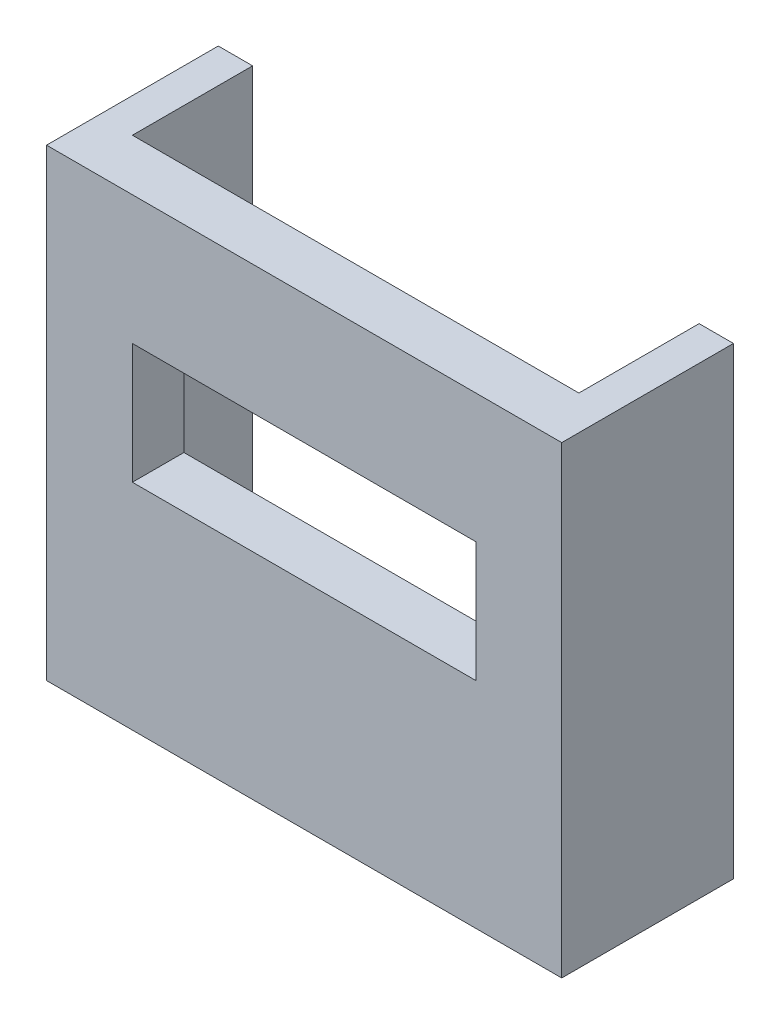
ISO-10303-21;
HEADER;
FILE_DESCRIPTION(('STEP AP214'),'2;1');
FILE_NAME('part.step','',(''),(''),'','','');
FILE_SCHEMA(('AUTOMOTIVE_DESIGN { 1 0 10303 214 1 1 1 1 }'));
ENDSEC;
DATA;
#1=APPLICATION_CONTEXT('core data for automotive mechanical design processes');
#2=APPLICATION_PROTOCOL_DEFINITION('international standard','automotive_design',2000,#1);
#3=PRODUCT_CONTEXT('',#1,'mechanical');
#4=PRODUCT('Part','Part','',(#3));
#5=PRODUCT_RELATED_PRODUCT_CATEGORY('part','',(#4));
#6=PRODUCT_DEFINITION_FORMATION('','',#4);
#7=PRODUCT_DEFINITION_CONTEXT('part definition',#1,'design');
#8=PRODUCT_DEFINITION('design','',#6,#7);
#9=PRODUCT_DEFINITION_SHAPE('','',#8);
#10=(LENGTH_UNIT() NAMED_UNIT(*) SI_UNIT(.MILLI.,.METRE.));
#11=(NAMED_UNIT(*) PLANE_ANGLE_UNIT() SI_UNIT($,.RADIAN.));
#12=(NAMED_UNIT(*) SI_UNIT($,.STERADIAN.) SOLID_ANGLE_UNIT());
#13=UNCERTAINTY_MEASURE_WITH_UNIT(LENGTH_MEASURE(1.E-05),#10,'distance_accuracy_value','');
#14=(GEOMETRIC_REPRESENTATION_CONTEXT(3) GLOBAL_UNCERTAINTY_ASSIGNED_CONTEXT((#13)) GLOBAL_UNIT_ASSIGNED_CONTEXT((#10,
#11,#12)) REPRESENTATION_CONTEXT('',''));
#15=CARTESIAN_POINT('',(0.,0.,0.));
#16=DIRECTION('',(0.,0.,1.));
#17=DIRECTION('',(1.,0.,0.));
#18=AXIS2_PLACEMENT_3D('',#15,#16,#17);
#19=CARTESIAN_POINT('',(0.,30.,0.));
#20=DIRECTION('',(-1.,0.,0.));
#21=DIRECTION('',(0.,0.,1.));
#22=AXIS2_PLACEMENT_3D('',#19,#20,#21);
#23=PLANE('',#22);
#24=DIRECTION('',(0.,0.,1.));
#25=VECTOR('',#24,1.);
#26=CARTESIAN_POINT('',(0.,27.,10.));
#27=LINE('',#26,#25);
#28=CARTESIAN_POINT('',(0.,27.,0.));
#29=VERTEX_POINT('',#28);
#30=CARTESIAN_POINT('',(0.,27.,10.));
#31=VERTEX_POINT('',#30);
#32=EDGE_CURVE('E138',#29,#31,#27,.T.);
#33=ORIENTED_EDGE('',*,*,#32,.T.);
#34=DIRECTION('',(0.,-1.,0.));
#35=VECTOR('',#34,1.);
#36=CARTESIAN_POINT('',(0.,30.,10.));
#37=LINE('',#36,#35);
#38=CARTESIAN_POINT('',(0.,0.,10.));
#39=VERTEX_POINT('',#38);
#40=EDGE_CURVE('E168',#31,#39,#37,.T.);
#41=ORIENTED_EDGE('',*,*,#40,.T.);
#42=DIRECTION('',(0.,0.,-1.));
#43=VECTOR('',#42,1.);
#44=CARTESIAN_POINT('',(0.,0.,0.));
#45=LINE('',#44,#43);
#46=CARTESIAN_POINT('',(0.,0.,0.));
#47=VERTEX_POINT('',#46);
#48=EDGE_CURVE('E159',#39,#47,#45,.T.);
#49=ORIENTED_EDGE('',*,*,#48,.T.);
#50=DIRECTION('',(0.,-1.,0.));
#51=VECTOR('',#50,1.);
#52=CARTESIAN_POINT('',(0.,30.,0.));
#53=LINE('',#52,#51);
#54=EDGE_CURVE('E46',#29,#47,#53,.T.);
#55=ORIENTED_EDGE('',*,*,#54,.F.);
#56=EDGE_LOOP('',(#33,#41,#49,#55));
#57=FACE_BOUND('',#56,.T.);
#58=ADVANCED_FACE('F38',(#57),#23,.F.);
#59=CARTESIAN_POINT('',(0.,30.,0.));
#60=DIRECTION('',(0.,0.,1.));
#61=DIRECTION('',(1.,0.,0.));
#62=AXIS2_PLACEMENT_3D('',#59,#60,#61);
#63=PLANE('',#62);
#64=DIRECTION('',(1.,0.,0.));
#65=VECTOR('',#64,1.);
#66=CARTESIAN_POINT('',(0.,27.,0.));
#67=LINE('',#66,#65);
#68=CARTESIAN_POINT('',(-2.,27.,0.));
#69=VERTEX_POINT('',#68);
#70=EDGE_CURVE('E141',#69,#29,#67,.T.);
#71=ORIENTED_EDGE('',*,*,#70,.T.);
#72=ORIENTED_EDGE('',*,*,#54,.T.);
#73=DIRECTION('',(-1.,0.,0.));
#74=VECTOR('',#73,1.);
#75=CARTESIAN_POINT('',(0.,0.,0.));
#76=LINE('',#75,#74);
#77=CARTESIAN_POINT('',(-12.5,0.,0.));
#78=VERTEX_POINT('',#77);
#79=EDGE_CURVE('E179',#47,#78,#76,.T.);
#80=ORIENTED_EDGE('',*,*,#79,.T.);
#81=DIRECTION('',(0.,1.,0.));
#82=VECTOR('',#81,1.);
#83=CARTESIAN_POINT('',(-12.5,-0.00100000000000013,0.));
#84=LINE('',#83,#82);
#85=CARTESIAN_POINT('',(-12.5,3.,0.));
#86=VERTEX_POINT('',#85);
#87=EDGE_CURVE('E269',#86,#78,#84,.F.);
#88=ORIENTED_EDGE('',*,*,#87,.F.);
#89=DIRECTION('',(-1.,0.,0.));
#90=VECTOR('',#89,1.);
#91=CARTESIAN_POINT('',(-2.,3.,0.));
#92=LINE('',#91,#90);
#93=CARTESIAN_POINT('',(-2.,3.,0.));
#94=VERTEX_POINT('',#93);
#95=EDGE_CURVE('E241',#94,#86,#92,.T.);
#96=ORIENTED_EDGE('',*,*,#95,.F.);
#97=DIRECTION('',(0.,-1.,0.));
#98=VECTOR('',#97,1.);
#99=CARTESIAN_POINT('',(-2.,27.,0.));
#100=LINE('',#99,#98);
#101=EDGE_CURVE('E61',#69,#94,#100,.T.);
#102=ORIENTED_EDGE('',*,*,#101,.F.);
#103=EDGE_LOOP('',(#71,#72,#80,#88,#96,#102));
#104=FACE_BOUND('',#103,.T.);
#105=ADVANCED_FACE('F150',(#104),#63,.F.);
#106=CARTESIAN_POINT('',(-30.,27.,0.));
#107=VERTEX_POINT('',#106);
#108=CARTESIAN_POINT('',(-28.,27.,0.));
#109=VERTEX_POINT('',#108);
#110=EDGE_CURVE('E155',#107,#109,#67,.T.);
#111=ORIENTED_EDGE('',*,*,#110,.T.);
#112=DIRECTION('',(0.,1.,0.));
#113=VECTOR('',#112,1.);
#114=CARTESIAN_POINT('',(-28.,27.,0.));
#115=LINE('',#114,#113);
#116=CARTESIAN_POINT('',(-28.,3.,0.));
#117=VERTEX_POINT('',#116);
#118=EDGE_CURVE('E236',#117,#109,#115,.T.);
#119=ORIENTED_EDGE('',*,*,#118,.F.);
#120=CARTESIAN_POINT('',(-17.5,3.,0.));
#121=VERTEX_POINT('',#120);
#122=EDGE_CURVE('E245',#121,#117,#92,.T.);
#123=ORIENTED_EDGE('',*,*,#122,.F.);
#124=DIRECTION('',(0.,1.,0.));
#125=VECTOR('',#124,1.);
#126=CARTESIAN_POINT('',(-17.5,-0.00100000000000013,0.));
#127=LINE('',#126,#125);
#128=CARTESIAN_POINT('',(-17.5,0.,0.));
#129=VERTEX_POINT('',#128);
#130=EDGE_CURVE('E53',#129,#121,#127,.T.);
#131=ORIENTED_EDGE('',*,*,#130,.F.);
#132=CARTESIAN_POINT('',(-30.,0.,0.));
#133=VERTEX_POINT('',#132);
#134=EDGE_CURVE('E182',#129,#133,#76,.T.);
#135=ORIENTED_EDGE('',*,*,#134,.T.);
#136=DIRECTION('',(0.,-1.,0.));
#137=VECTOR('',#136,1.);
#138=CARTESIAN_POINT('',(-30.,30.,0.));
#139=LINE('',#138,#137);
#140=EDGE_CURVE('E161',#107,#133,#139,.T.);
#141=ORIENTED_EDGE('',*,*,#140,.F.);
#142=EDGE_LOOP('',(#111,#119,#123,#131,#135,#141));
#143=FACE_BOUND('',#142,.T.);
#144=ADVANCED_FACE('F284',(#143),#63,.F.);
#145=CARTESIAN_POINT('',(-30.,30.,0.));
#146=DIRECTION('',(1.,0.,0.));
#147=DIRECTION('',(0.,0.,-1.));
#148=AXIS2_PLACEMENT_3D('',#145,#146,#147);
#149=PLANE('',#148);
#150=DIRECTION('',(0.,0.,-1.));
#151=VECTOR('',#150,1.);
#152=CARTESIAN_POINT('',(-30.,27.,0.));
#153=LINE('',#152,#151);
#154=CARTESIAN_POINT('',(-30.,27.,10.));
#155=VERTEX_POINT('',#154);
#156=EDGE_CURVE('E276',#155,#107,#153,.T.);
#157=ORIENTED_EDGE('',*,*,#156,.T.);
#158=ORIENTED_EDGE('',*,*,#140,.T.);
#159=DIRECTION('',(0.,0.,1.));
#160=VECTOR('',#159,1.);
#161=CARTESIAN_POINT('',(-30.,0.,0.));
#162=LINE('',#161,#160);
#163=CARTESIAN_POINT('',(-30.,0.,10.));
#164=VERTEX_POINT('',#163);
#165=EDGE_CURVE('E175',#133,#164,#162,.T.);
#166=ORIENTED_EDGE('',*,*,#165,.T.);
#167=DIRECTION('',(0.,-1.,0.));
#168=VECTOR('',#167,1.);
#169=CARTESIAN_POINT('',(-30.,30.,10.));
#170=LINE('',#169,#168);
#171=EDGE_CURVE('E163',#155,#164,#170,.T.);
#172=ORIENTED_EDGE('',*,*,#171,.F.);
#173=EDGE_LOOP('',(#157,#158,#166,#172));
#174=FACE_BOUND('',#173,.T.);
#175=ADVANCED_FACE('F303',(#174),#149,.F.);
#176=CARTESIAN_POINT('',(0.,30.,10.));
#177=DIRECTION('',(0.,0.,-1.));
#178=DIRECTION('',(-1.,0.,0.));
#179=AXIS2_PLACEMENT_3D('',#176,#177,#178);
#180=PLANE('',#179);
#181=DIRECTION('',(1.,0.,0.));
#182=VECTOR('',#181,1.);
#183=CARTESIAN_POINT('',(-25.,12.5,10.));
#184=LINE('',#183,#182);
#185=CARTESIAN_POINT('',(-25.,12.5,10.));
#186=VERTEX_POINT('',#185);
#187=CARTESIAN_POINT('',(-5.,12.5,10.));
#188=VERTEX_POINT('',#187);
#189=EDGE_CURVE('E205',#186,#188,#184,.T.);
#190=ORIENTED_EDGE('',*,*,#189,.F.);
#191=DIRECTION('',(0.,-1.,0.));
#192=VECTOR('',#191,1.);
#193=CARTESIAN_POINT('',(-25.,12.5,10.));
#194=LINE('',#193,#192);
#195=CARTESIAN_POINT('',(-25.,19.5,10.));
#196=VERTEX_POINT('',#195);
#197=EDGE_CURVE('E209',#196,#186,#194,.T.);
#198=ORIENTED_EDGE('',*,*,#197,.F.);
#199=DIRECTION('',(-1.,0.,0.));
#200=VECTOR('',#199,1.);
#201=CARTESIAN_POINT('',(-25.,19.5,10.));
#202=LINE('',#201,#200);
#203=CARTESIAN_POINT('',(-5.,19.5,10.));
#204=VERTEX_POINT('',#203);
#205=EDGE_CURVE('E190',#204,#196,#202,.T.);
#206=ORIENTED_EDGE('',*,*,#205,.F.);
#207=DIRECTION('',(0.,1.,0.));
#208=VECTOR('',#207,1.);
#209=CARTESIAN_POINT('',(-5.,12.5,10.));
#210=LINE('',#209,#208);
#211=EDGE_CURVE('E201',#188,#204,#210,.T.);
#212=ORIENTED_EDGE('',*,*,#211,.F.);
#213=EDGE_LOOP('',(#190,#198,#206,#212));
#214=FACE_BOUND('',#213,.T.);
#215=DIRECTION('',(-1.,0.,0.));
#216=VECTOR('',#215,1.);
#217=CARTESIAN_POINT('',(-30.,27.,10.));
#218=LINE('',#217,#216);
#219=EDGE_CURVE('E143',#31,#155,#218,.T.);
#220=ORIENTED_EDGE('',*,*,#219,.T.);
#221=ORIENTED_EDGE('',*,*,#171,.T.);
#222=DIRECTION('',(1.,0.,0.));
#223=VECTOR('',#222,1.);
#224=CARTESIAN_POINT('',(0.,0.,10.));
#225=LINE('',#224,#223);
#226=EDGE_CURVE('E171',#164,#39,#225,.T.);
#227=ORIENTED_EDGE('',*,*,#226,.T.);
#228=ORIENTED_EDGE('',*,*,#40,.F.);
#229=EDGE_LOOP('',(#220,#221,#227,#228));
#230=FACE_BOUND('',#229,.T.);
#231=ADVANCED_FACE('F305',(#214,#230),#180,.F.);
#232=CARTESIAN_POINT('',(-25.,12.5,-0.000999999999999265));
#233=DIRECTION('',(-1.,0.,0.));
#234=DIRECTION('',(0.,0.,1.));
#235=AXIS2_PLACEMENT_3D('',#232,#233,#234);
#236=PLANE('',#235);
#237=DIRECTION('',(0.,-1.,0.));
#238=VECTOR('',#237,1.);
#239=CARTESIAN_POINT('',(-25.,12.5,7.));
#240=LINE('',#239,#238);
#241=CARTESIAN_POINT('',(-25.,19.5,7.));
#242=VERTEX_POINT('',#241);
#243=CARTESIAN_POINT('',(-25.,12.5,7.));
#244=VERTEX_POINT('',#243);
#245=EDGE_CURVE('E213',#242,#244,#240,.T.);
#246=ORIENTED_EDGE('',*,*,#245,.F.);
#247=DIRECTION('',(0.,0.,1.));
#248=VECTOR('',#247,1.);
#249=CARTESIAN_POINT('',(-25.,19.5,-0.000999999999999265));
#250=LINE('',#249,#248);
#251=EDGE_CURVE('E185',#242,#196,#250,.T.);
#252=ORIENTED_EDGE('',*,*,#251,.T.);
#253=ORIENTED_EDGE('',*,*,#197,.T.);
#254=DIRECTION('',(0.,0.,1.));
#255=VECTOR('',#254,1.);
#256=CARTESIAN_POINT('',(-25.,12.5,-0.000999999999999265));
#257=LINE('',#256,#255);
#258=EDGE_CURVE('E186',#244,#186,#257,.T.);
#259=ORIENTED_EDGE('',*,*,#258,.F.);
#260=EDGE_LOOP('',(#246,#252,#253,#259));
#261=FACE_BOUND('',#260,.T.);
#262=ADVANCED_FACE('F324',(#261),#236,.F.);
#263=CARTESIAN_POINT('',(-25.,19.5,-0.000999999999999265));
#264=DIRECTION('',(0.,1.,0.));
#265=DIRECTION('',(0.,0.,1.));
#266=AXIS2_PLACEMENT_3D('',#263,#264,#265);
#267=PLANE('',#266);
#268=DIRECTION('',(-1.,0.,0.));
#269=VECTOR('',#268,1.);
#270=CARTESIAN_POINT('',(-25.,19.5,7.));
#271=LINE('',#270,#269);
#272=CARTESIAN_POINT('',(-5.,19.5,7.));
#273=VERTEX_POINT('',#272);
#274=EDGE_CURVE('E216',#273,#242,#271,.T.);
#275=ORIENTED_EDGE('',*,*,#274,.F.);
#276=DIRECTION('',(0.,0.,1.));
#277=VECTOR('',#276,1.);
#278=CARTESIAN_POINT('',(-5.,19.5,-0.000999999999999265));
#279=LINE('',#278,#277);
#280=EDGE_CURVE('E193',#273,#204,#279,.T.);
#281=ORIENTED_EDGE('',*,*,#280,.T.);
#282=ORIENTED_EDGE('',*,*,#205,.T.);
#283=ORIENTED_EDGE('',*,*,#251,.F.);
#284=EDGE_LOOP('',(#275,#281,#282,#283));
#285=FACE_BOUND('',#284,.T.);
#286=ADVANCED_FACE('F334',(#285),#267,.F.);
#287=CARTESIAN_POINT('',(-5.,12.5,-0.000999999999999265));
#288=DIRECTION('',(1.,0.,0.));
#289=DIRECTION('',(0.,0.,-1.));
#290=AXIS2_PLACEMENT_3D('',#287,#288,#289);
#291=PLANE('',#290);
#292=DIRECTION('',(0.,1.,0.));
#293=VECTOR('',#292,1.);
#294=CARTESIAN_POINT('',(-5.,12.5,7.));
#295=LINE('',#294,#293);
#296=CARTESIAN_POINT('',(-5.,12.5,7.));
#297=VERTEX_POINT('',#296);
#298=EDGE_CURVE('E219',#297,#273,#295,.T.);
#299=ORIENTED_EDGE('',*,*,#298,.F.);
#300=DIRECTION('',(0.,0.,1.));
#301=VECTOR('',#300,1.);
#302=CARTESIAN_POINT('',(-5.,12.5,-0.000999999999999265));
#303=LINE('',#302,#301);
#304=EDGE_CURVE('E189',#297,#188,#303,.T.);
#305=ORIENTED_EDGE('',*,*,#304,.T.);
#306=ORIENTED_EDGE('',*,*,#211,.T.);
#307=ORIENTED_EDGE('',*,*,#280,.F.);
#308=EDGE_LOOP('',(#299,#305,#306,#307));
#309=FACE_BOUND('',#308,.T.);
#310=ADVANCED_FACE('F332',(#309),#291,.F.);
#311=CARTESIAN_POINT('',(-25.,12.5,-0.000999999999999265));
#312=DIRECTION('',(0.,-1.,0.));
#313=DIRECTION('',(0.,0.,-1.));
#314=AXIS2_PLACEMENT_3D('',#311,#312,#313);
#315=PLANE('',#314);
#316=DIRECTION('',(1.,0.,0.));
#317=VECTOR('',#316,1.);
#318=CARTESIAN_POINT('',(-25.,12.5,7.));
#319=LINE('',#318,#317);
#320=EDGE_CURVE('E11',#244,#297,#319,.T.);
#321=ORIENTED_EDGE('',*,*,#320,.F.);
#322=ORIENTED_EDGE('',*,*,#258,.T.);
#323=ORIENTED_EDGE('',*,*,#189,.T.);
#324=ORIENTED_EDGE('',*,*,#304,.F.);
#325=EDGE_LOOP('',(#321,#322,#323,#324));
#326=FACE_BOUND('',#325,.T.);
#327=ADVANCED_FACE('F323',(#326),#315,.F.);
#328=CARTESIAN_POINT('',(0.,0.,0.));
#329=DIRECTION('',(0.,-1.,0.));
#330=DIRECTION('',(0.,0.,-1.));
#331=AXIS2_PLACEMENT_3D('',#328,#329,#330);
#332=PLANE('',#331);
#333=CARTESIAN_POINT('',(-15.,0.,0.));
#334=DIRECTION('',(0.,-1.,0.));
#335=DIRECTION('',(0.,0.,-1.));
#336=AXIS2_PLACEMENT_3D('',#333,#334,#335);
#337=CIRCLE('',#336,2.5);
#338=EDGE_CURVE('E248',#129,#78,#337,.F.);
#339=ORIENTED_EDGE('',*,*,#338,.T.);
#340=ORIENTED_EDGE('',*,*,#79,.F.);
#341=ORIENTED_EDGE('',*,*,#48,.F.);
#342=ORIENTED_EDGE('',*,*,#226,.F.);
#343=ORIENTED_EDGE('',*,*,#165,.F.);
#344=ORIENTED_EDGE('',*,*,#134,.F.);
#345=EDGE_LOOP('',(#339,#340,#341,#342,#343,#344));
#346=FACE_BOUND('',#345,.T.);
#347=ADVANCED_FACE('F300',(#346),#332,.T.);
#348=CARTESIAN_POINT('',(0.,0.,7.));
#349=DIRECTION('',(0.,0.,-1.));
#350=DIRECTION('',(-1.,0.,0.));
#351=AXIS2_PLACEMENT_3D('',#348,#349,#350);
#352=PLANE('',#351);
#353=DIRECTION('',(0.,-1.,0.));
#354=VECTOR('',#353,1.);
#355=CARTESIAN_POINT('',(-2.,27.,7.));
#356=LINE('',#355,#354);
#357=CARTESIAN_POINT('',(-2.,27.,7.));
#358=VERTEX_POINT('',#357);
#359=CARTESIAN_POINT('',(-2.,3.,7.));
#360=VERTEX_POINT('',#359);
#361=EDGE_CURVE('E240',#358,#360,#356,.T.);
#362=ORIENTED_EDGE('',*,*,#361,.T.);
#363=DIRECTION('',(-1.,0.,0.));
#364=VECTOR('',#363,1.);
#365=CARTESIAN_POINT('',(-2.,3.,7.));
#366=LINE('',#365,#364);
#367=CARTESIAN_POINT('',(-28.,3.,7.));
#368=VERTEX_POINT('',#367);
#369=EDGE_CURVE('E256',#360,#368,#366,.T.);
#370=ORIENTED_EDGE('',*,*,#369,.T.);
#371=DIRECTION('',(0.,1.,0.));
#372=VECTOR('',#371,1.);
#373=CARTESIAN_POINT('',(-28.,27.,7.));
#374=LINE('',#373,#372);
#375=CARTESIAN_POINT('',(-28.,27.,7.));
#376=VERTEX_POINT('',#375);
#377=EDGE_CURVE('E252',#368,#376,#374,.T.);
#378=ORIENTED_EDGE('',*,*,#377,.T.);
#379=DIRECTION('',(1.,0.,0.));
#380=VECTOR('',#379,1.);
#381=CARTESIAN_POINT('',(-2.,27.,7.));
#382=LINE('',#381,#380);
#383=EDGE_CURVE('E227',#376,#358,#382,.T.);
#384=ORIENTED_EDGE('',*,*,#383,.T.);
#385=EDGE_LOOP('',(#362,#370,#378,#384));
#386=FACE_BOUND('',#385,.T.);
#387=ORIENTED_EDGE('',*,*,#245,.T.);
#388=ORIENTED_EDGE('',*,*,#320,.T.);
#389=ORIENTED_EDGE('',*,*,#298,.T.);
#390=ORIENTED_EDGE('',*,*,#274,.T.);
#391=EDGE_LOOP('',(#387,#388,#389,#390));
#392=FACE_BOUND('',#391,.T.);
#393=ADVANCED_FACE('F310',(#386,#392),#352,.T.);
#394=CARTESIAN_POINT('',(-2.,27.,7.));
#395=DIRECTION('',(1.,0.,0.));
#396=DIRECTION('',(0.,1.,0.));
#397=AXIS2_PLACEMENT_3D('',#394,#395,#396);
#398=PLANE('',#397);
#399=ORIENTED_EDGE('',*,*,#101,.T.);
#400=DIRECTION('',(0.,0.,-1.));
#401=VECTOR('',#400,1.);
#402=CARTESIAN_POINT('',(-2.,3.,7.));
#403=LINE('',#402,#401);
#404=EDGE_CURVE('E223',#360,#94,#403,.T.);
#405=ORIENTED_EDGE('',*,*,#404,.F.);
#406=ORIENTED_EDGE('',*,*,#361,.F.);
#407=DIRECTION('',(0.,0.,-1.));
#408=VECTOR('',#407,1.);
#409=CARTESIAN_POINT('',(-2.,27.,7.));
#410=LINE('',#409,#408);
#411=EDGE_CURVE('E222',#358,#69,#410,.T.);
#412=ORIENTED_EDGE('',*,*,#411,.T.);
#413=EDGE_LOOP('',(#399,#405,#406,#412));
#414=FACE_BOUND('',#413,.T.);
#415=ADVANCED_FACE('F308',(#414),#398,.F.);
#416=CARTESIAN_POINT('',(-28.,27.,7.));
#417=DIRECTION('',(-1.,0.,0.));
#418=DIRECTION('',(0.,-1.,0.));
#419=AXIS2_PLACEMENT_3D('',#416,#417,#418);
#420=PLANE('',#419);
#421=ORIENTED_EDGE('',*,*,#118,.T.);
#422=DIRECTION('',(0.,0.,-1.));
#423=VECTOR('',#422,1.);
#424=CARTESIAN_POINT('',(-28.,27.,7.));
#425=LINE('',#424,#423);
#426=EDGE_CURVE('E231',#376,#109,#425,.T.);
#427=ORIENTED_EDGE('',*,*,#426,.F.);
#428=ORIENTED_EDGE('',*,*,#377,.F.);
#429=DIRECTION('',(0.,0.,-1.));
#430=VECTOR('',#429,1.);
#431=CARTESIAN_POINT('',(-28.,3.,7.));
#432=LINE('',#431,#430);
#433=EDGE_CURVE('E226',#368,#117,#432,.T.);
#434=ORIENTED_EDGE('',*,*,#433,.T.);
#435=EDGE_LOOP('',(#421,#427,#428,#434));
#436=FACE_BOUND('',#435,.T.);
#437=ADVANCED_FACE('F289',(#436),#420,.F.);
#438=CARTESIAN_POINT('',(-2.,3.,7.));
#439=DIRECTION('',(0.,-1.,0.));
#440=DIRECTION('',(0.,0.,-1.));
#441=AXIS2_PLACEMENT_3D('',#438,#439,#440);
#442=PLANE('',#441);
#443=ORIENTED_EDGE('',*,*,#95,.T.);
#444=CARTESIAN_POINT('',(-15.,3.,0.));
#445=DIRECTION('',(0.,1.,0.));
#446=DIRECTION('',(0.,0.,1.));
#447=AXIS2_PLACEMENT_3D('',#444,#445,#446);
#448=CIRCLE('',#447,2.5);
#449=EDGE_CURVE('E266',#121,#86,#448,.T.);
#450=ORIENTED_EDGE('',*,*,#449,.F.);
#451=ORIENTED_EDGE('',*,*,#122,.T.);
#452=ORIENTED_EDGE('',*,*,#433,.F.);
#453=ORIENTED_EDGE('',*,*,#369,.F.);
#454=ORIENTED_EDGE('',*,*,#404,.T.);
#455=EDGE_LOOP('',(#443,#450,#451,#452,#453,#454));
#456=FACE_BOUND('',#455,.T.);
#457=ADVANCED_FACE('F293',(#456),#442,.F.);
#458=CARTESIAN_POINT('',(-15.,-0.00100000000000013,0.));
#459=DIRECTION('',(0.,1.,0.));
#460=DIRECTION('',(0.,0.,1.));
#461=AXIS2_PLACEMENT_3D('',#458,#459,#460);
#462=CYLINDRICAL_SURFACE('',#461,2.5);
#463=ORIENTED_EDGE('',*,*,#87,.T.);
#464=ORIENTED_EDGE('',*,*,#338,.F.);
#465=ORIENTED_EDGE('',*,*,#130,.T.);
#466=ORIENTED_EDGE('',*,*,#449,.T.);
#467=EDGE_LOOP('',(#463,#464,#465,#466));
#468=FACE_BOUND('',#467,.T.);
#469=ADVANCED_FACE('F400',(#468),#462,.F.);
#470=CARTESIAN_POINT('',(-2.,27.,7.));
#471=DIRECTION('',(0.,1.,0.));
#472=DIRECTION('',(0.,0.,1.));
#473=AXIS2_PLACEMENT_3D('',#470,#471,#472);
#474=PLANE('',#473);
#475=ORIENTED_EDGE('',*,*,#411,.F.);
#476=ORIENTED_EDGE('',*,*,#383,.F.);
#477=ORIENTED_EDGE('',*,*,#426,.T.);
#478=ORIENTED_EDGE('',*,*,#110,.F.);
#479=ORIENTED_EDGE('',*,*,#156,.F.);
#480=ORIENTED_EDGE('',*,*,#219,.F.);
#481=ORIENTED_EDGE('',*,*,#32,.F.);
#482=ORIENTED_EDGE('',*,*,#70,.F.);
#483=EDGE_LOOP('',(#475,#476,#477,#478,#479,#480,#481,#482));
#484=FACE_BOUND('',#483,.T.);
#485=ADVANCED_FACE('F140',(#484),#474,.T.);
#486=CLOSED_SHELL('',(#58,#105,#144,#175,#231,#262,#286,#310,#327,#347,#393,#415,#437,#457,#469,#485));
#487=MANIFOLD_SOLID_BREP('B2',#486);
#488=ADVANCED_BREP_SHAPE_REPRESENTATION('',(#18,#487),#14);
#489=SHAPE_DEFINITION_REPRESENTATION(#9,#488);
ENDSEC;
END-ISO-10303-21;
